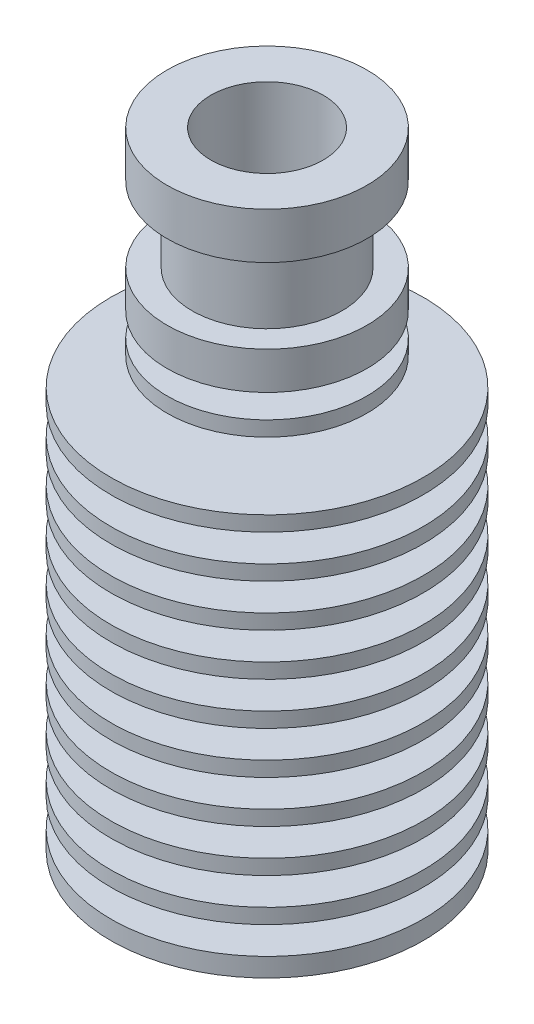
ISO-10303-21;
HEADER;
FILE_DESCRIPTION(('STEP AP214'),'2;1');
FILE_NAME('part.step','',(''),(''),'','','');
FILE_SCHEMA(('AUTOMOTIVE_DESIGN { 1 0 10303 214 1 1 1 1 }'));
ENDSEC;
DATA;
#1=APPLICATION_CONTEXT('core data for automotive mechanical design processes');
#2=APPLICATION_PROTOCOL_DEFINITION('international standard','automotive_design',2000,#1);
#3=PRODUCT_CONTEXT('',#1,'mechanical');
#4=PRODUCT('Part','Part','',(#3));
#5=PRODUCT_RELATED_PRODUCT_CATEGORY('part','',(#4));
#6=PRODUCT_DEFINITION_FORMATION('','',#4);
#7=PRODUCT_DEFINITION_CONTEXT('part definition',#1,'design');
#8=PRODUCT_DEFINITION('design','',#6,#7);
#9=PRODUCT_DEFINITION_SHAPE('','',#8);
#10=(LENGTH_UNIT() NAMED_UNIT(*) SI_UNIT(.MILLI.,.METRE.));
#11=(NAMED_UNIT(*) PLANE_ANGLE_UNIT() SI_UNIT($,.RADIAN.));
#12=(NAMED_UNIT(*) SI_UNIT($,.STERADIAN.) SOLID_ANGLE_UNIT());
#13=UNCERTAINTY_MEASURE_WITH_UNIT(LENGTH_MEASURE(1.E-05),#10,'distance_accuracy_value','');
#14=(GEOMETRIC_REPRESENTATION_CONTEXT(3) GLOBAL_UNCERTAINTY_ASSIGNED_CONTEXT((#13)) GLOBAL_UNIT_ASSIGNED_CONTEXT((#10,
#11,#12)) REPRESENTATION_CONTEXT('',''));
#15=CARTESIAN_POINT('',(0.,0.,0.));
#16=DIRECTION('',(0.,0.,1.));
#17=DIRECTION('',(1.,0.,0.));
#18=AXIS2_PLACEMENT_3D('',#15,#16,#17);
#19=CARTESIAN_POINT('',(0.,64.6374556213018,0.));
#20=DIRECTION('',(0.,1.,0.));
#21=DIRECTION('',(-1.,0.,0.));
#22=AXIS2_PLACEMENT_3D('',#19,#20,#21);
#23=CYLINDRICAL_SURFACE('',#22,8.);
#24=CARTESIAN_POINT('',(0.,54.9374556213018,0.));
#25=DIRECTION('',(0.,1.,0.));
#26=DIRECTION('',(-1.,0.,0.));
#27=AXIS2_PLACEMENT_3D('',#24,#25,#26);
#28=CIRCLE('',#27,8.);
#29=CARTESIAN_POINT('',(-8.,54.9374556213018,0.));
#30=VERTEX_POINT('',#29);
#31=EDGE_CURVE('E218',#30,#30,#28,.T.);
#32=ORIENTED_EDGE('',*,*,#31,.F.);
#33=EDGE_LOOP('',(#32));
#34=FACE_BOUND('',#33,.T.);
#35=CARTESIAN_POINT('',(0.,51.9374556213018,0.));
#36=DIRECTION('',(0.,1.,0.));
#37=DIRECTION('',(-1.,0.,0.));
#38=AXIS2_PLACEMENT_3D('',#35,#36,#37);
#39=CIRCLE('',#38,8.);
#40=CARTESIAN_POINT('',(-7.99999999999999,51.9374556213018,0.));
#41=VERTEX_POINT('',#40);
#42=EDGE_CURVE('E12',#41,#41,#39,.T.);
#43=ORIENTED_EDGE('',*,*,#42,.T.);
#44=EDGE_LOOP('',(#43));
#45=FACE_BOUND('',#44,.T.);
#46=ADVANCED_FACE('F40',(#34,#45),#23,.T.);
#47=CARTESIAN_POINT('',(8.,51.9374556213018,0.));
#48=DIRECTION('',(0.,1.,0.));
#49=DIRECTION('',(-1.,0.,0.));
#50=AXIS2_PLACEMENT_3D('',#47,#48,#49);
#51=PLANE('',#50);
#52=ORIENTED_EDGE('',*,*,#42,.F.);
#53=EDGE_LOOP('',(#52));
#54=FACE_BOUND('',#53,.T.);
#55=CARTESIAN_POINT('',(0.,51.9374556213018,0.));
#56=DIRECTION('',(0.,1.,0.));
#57=DIRECTION('',(-1.,0.,0.));
#58=AXIS2_PLACEMENT_3D('',#55,#56,#57);
#59=CIRCLE('',#58,4.5);
#60=CARTESIAN_POINT('',(-4.49999999999999,51.9374556213018,0.));
#61=VERTEX_POINT('',#60);
#62=EDGE_CURVE('E46',#61,#61,#59,.T.);
#63=ORIENTED_EDGE('',*,*,#62,.T.);
#64=EDGE_LOOP('',(#63));
#65=FACE_BOUND('',#64,.T.);
#66=ADVANCED_FACE('F225',(#54,#65),#51,.F.);
#67=CARTESIAN_POINT('',(0.,64.6374556213018,0.));
#68=DIRECTION('',(0.,1.,0.));
#69=DIRECTION('',(-1.,0.,0.));
#70=AXIS2_PLACEMENT_3D('',#67,#68,#69);
#71=CYLINDRICAL_SURFACE('',#70,4.5);
#72=ORIENTED_EDGE('',*,*,#62,.F.);
#73=EDGE_LOOP('',(#72));
#74=FACE_BOUND('',#73,.T.);
#75=CARTESIAN_POINT('',(0.,50.0374556213018,0.));
#76=DIRECTION('',(0.,1.,0.));
#77=DIRECTION('',(-1.,0.,0.));
#78=AXIS2_PLACEMENT_3D('',#75,#76,#77);
#79=CIRCLE('',#78,4.5);
#80=CARTESIAN_POINT('',(-4.49999999999999,50.0374556213018,0.));
#81=VERTEX_POINT('',#80);
#82=EDGE_CURVE('E50',#81,#81,#79,.T.);
#83=ORIENTED_EDGE('',*,*,#82,.T.);
#84=EDGE_LOOP('',(#83));
#85=FACE_BOUND('',#84,.T.);
#86=ADVANCED_FACE('F229',(#74,#85),#71,.T.);
#87=CARTESIAN_POINT('',(4.5,50.0374556213018,0.));
#88=DIRECTION('',(0.,-1.,0.));
#89=DIRECTION('',(1.,0.,0.));
#90=AXIS2_PLACEMENT_3D('',#87,#88,#89);
#91=PLANE('',#90);
#92=ORIENTED_EDGE('',*,*,#82,.F.);
#93=EDGE_LOOP('',(#92));
#94=FACE_BOUND('',#93,.T.);
#95=CARTESIAN_POINT('',(0.,50.0374556213018,0.));
#96=DIRECTION('',(0.,1.,0.));
#97=DIRECTION('',(-1.,0.,0.));
#98=AXIS2_PLACEMENT_3D('',#95,#96,#97);
#99=CIRCLE('',#98,8.);
#100=CARTESIAN_POINT('',(-7.99999999999999,50.0374556213018,0.));
#101=VERTEX_POINT('',#100);
#102=EDGE_CURVE('E54',#101,#101,#99,.T.);
#103=ORIENTED_EDGE('',*,*,#102,.T.);
#104=EDGE_LOOP('',(#103));
#105=FACE_BOUND('',#104,.T.);
#106=ADVANCED_FACE('F234',(#94,#105),#91,.F.);
#107=CARTESIAN_POINT('',(0.,64.6374556213018,0.));
#108=DIRECTION('',(0.,1.,0.));
#109=DIRECTION('',(-1.,0.,0.));
#110=AXIS2_PLACEMENT_3D('',#107,#108,#109);
#111=CYLINDRICAL_SURFACE('',#110,8.);
#112=ORIENTED_EDGE('',*,*,#102,.F.);
#113=EDGE_LOOP('',(#112));
#114=FACE_BOUND('',#113,.T.);
#115=CARTESIAN_POINT('',(0.,48.8374556213018,0.));
#116=DIRECTION('',(0.,1.,0.));
#117=DIRECTION('',(-1.,0.,0.));
#118=AXIS2_PLACEMENT_3D('',#115,#116,#117);
#119=CIRCLE('',#118,8.);
#120=CARTESIAN_POINT('',(-7.99999999999999,48.8374556213018,0.));
#121=VERTEX_POINT('',#120);
#122=EDGE_CURVE('E59',#121,#121,#119,.T.);
#123=ORIENTED_EDGE('',*,*,#122,.T.);
#124=EDGE_LOOP('',(#123));
#125=FACE_BOUND('',#124,.T.);
#126=ADVANCED_FACE('F240',(#114,#125),#111,.T.);
#127=CARTESIAN_POINT('',(8.,48.8374556213018,0.));
#128=DIRECTION('',(0.,1.,0.));
#129=DIRECTION('',(-1.,0.,0.));
#130=AXIS2_PLACEMENT_3D('',#127,#128,#129);
#131=PLANE('',#130);
#132=ORIENTED_EDGE('',*,*,#122,.F.);
#133=EDGE_LOOP('',(#132));
#134=FACE_BOUND('',#133,.T.);
#135=CARTESIAN_POINT('',(0.,48.8374556213018,0.));
#136=DIRECTION('',(0.,1.,0.));
#137=DIRECTION('',(-1.,0.,0.));
#138=AXIS2_PLACEMENT_3D('',#135,#136,#137);
#139=CIRCLE('',#138,4.);
#140=CARTESIAN_POINT('',(-4.,48.8374556213018,0.));
#141=VERTEX_POINT('',#140);
#142=EDGE_CURVE('E62',#141,#141,#139,.T.);
#143=ORIENTED_EDGE('',*,*,#142,.T.);
#144=EDGE_LOOP('',(#143));
#145=FACE_BOUND('',#144,.T.);
#146=ADVANCED_FACE('F244',(#134,#145),#131,.F.);
#147=CARTESIAN_POINT('',(0.,64.6374556213018,0.));
#148=DIRECTION('',(0.,1.,0.));
#149=DIRECTION('',(-1.,0.,0.));
#150=AXIS2_PLACEMENT_3D('',#147,#148,#149);
#151=CYLINDRICAL_SURFACE('',#150,4.);
#152=ORIENTED_EDGE('',*,*,#142,.F.);
#153=EDGE_LOOP('',(#152));
#154=FACE_BOUND('',#153,.T.);
#155=CARTESIAN_POINT('',(0.,46.6374556213018,0.));
#156=DIRECTION('',(0.,1.,0.));
#157=DIRECTION('',(-1.,0.,0.));
#158=AXIS2_PLACEMENT_3D('',#155,#156,#157);
#159=CIRCLE('',#158,4.);
#160=CARTESIAN_POINT('',(-3.99999999999999,46.6374556213018,0.));
#161=VERTEX_POINT('',#160);
#162=EDGE_CURVE('E65',#161,#161,#159,.T.);
#163=ORIENTED_EDGE('',*,*,#162,.T.);
#164=EDGE_LOOP('',(#163));
#165=FACE_BOUND('',#164,.T.);
#166=ADVANCED_FACE('F248',(#154,#165),#151,.T.);
#167=CARTESIAN_POINT('',(4.,46.6374556213018,0.));
#168=DIRECTION('',(0.,-1.,0.));
#169=DIRECTION('',(1.,0.,0.));
#170=AXIS2_PLACEMENT_3D('',#167,#168,#169);
#171=PLANE('',#170);
#172=ORIENTED_EDGE('',*,*,#162,.F.);
#173=EDGE_LOOP('',(#172));
#174=FACE_BOUND('',#173,.T.);
#175=CARTESIAN_POINT('',(0.,46.6374556213018,0.));
#176=DIRECTION('',(0.,1.,0.));
#177=DIRECTION('',(-1.,0.,0.));
#178=AXIS2_PLACEMENT_3D('',#175,#176,#177);
#179=CIRCLE('',#178,12.5);
#180=CARTESIAN_POINT('',(-12.5,46.6374556213018,0.));
#181=VERTEX_POINT('',#180);
#182=EDGE_CURVE('E68',#181,#181,#179,.T.);
#183=ORIENTED_EDGE('',*,*,#182,.T.);
#184=EDGE_LOOP('',(#183));
#185=FACE_BOUND('',#184,.T.);
#186=ADVANCED_FACE('F252',(#174,#185),#171,.F.);
#187=CARTESIAN_POINT('',(0.,64.6374556213018,0.));
#188=DIRECTION('',(0.,1.,0.));
#189=DIRECTION('',(-1.,0.,0.));
#190=AXIS2_PLACEMENT_3D('',#187,#188,#189);
#191=CYLINDRICAL_SURFACE('',#190,12.5);
#192=ORIENTED_EDGE('',*,*,#182,.F.);
#193=EDGE_LOOP('',(#192));
#194=FACE_BOUND('',#193,.T.);
#195=CARTESIAN_POINT('',(0.,45.4374556213018,0.));
#196=DIRECTION('',(0.,1.,0.));
#197=DIRECTION('',(-1.,0.,0.));
#198=AXIS2_PLACEMENT_3D('',#195,#196,#197);
#199=CIRCLE('',#198,12.5);
#200=CARTESIAN_POINT('',(-12.5,45.4374556213018,0.));
#201=VERTEX_POINT('',#200);
#202=EDGE_CURVE('E71',#201,#201,#199,.T.);
#203=ORIENTED_EDGE('',*,*,#202,.T.);
#204=EDGE_LOOP('',(#203));
#205=FACE_BOUND('',#204,.T.);
#206=ADVANCED_FACE('F256',(#194,#205),#191,.T.);
#207=CARTESIAN_POINT('',(12.5,45.4374556213018,0.));
#208=DIRECTION('',(0.,1.,0.));
#209=DIRECTION('',(-1.,0.,0.));
#210=AXIS2_PLACEMENT_3D('',#207,#208,#209);
#211=PLANE('',#210);
#212=ORIENTED_EDGE('',*,*,#202,.F.);
#213=EDGE_LOOP('',(#212));
#214=FACE_BOUND('',#213,.T.);
#215=CARTESIAN_POINT('',(0.,45.4374556213018,0.));
#216=DIRECTION('',(0.,1.,0.));
#217=DIRECTION('',(-1.,0.,0.));
#218=AXIS2_PLACEMENT_3D('',#215,#216,#217);
#219=CIRCLE('',#218,4.);
#220=CARTESIAN_POINT('',(-3.99999999999999,45.4374556213018,0.));
#221=VERTEX_POINT('',#220);
#222=EDGE_CURVE('E74',#221,#221,#219,.T.);
#223=ORIENTED_EDGE('',*,*,#222,.T.);
#224=EDGE_LOOP('',(#223));
#225=FACE_BOUND('',#224,.T.);
#226=ADVANCED_FACE('F260',(#214,#225),#211,.F.);
#227=CARTESIAN_POINT('',(0.,64.6374556213018,0.));
#228=DIRECTION('',(0.,1.,0.));
#229=DIRECTION('',(-1.,0.,0.));
#230=AXIS2_PLACEMENT_3D('',#227,#228,#229);
#231=CYLINDRICAL_SURFACE('',#230,4.);
#232=ORIENTED_EDGE('',*,*,#222,.F.);
#233=EDGE_LOOP('',(#232));
#234=FACE_BOUND('',#233,.T.);
#235=CARTESIAN_POINT('',(0.,43.2374556213018,0.));
#236=DIRECTION('',(0.,1.,0.));
#237=DIRECTION('',(-1.,0.,0.));
#238=AXIS2_PLACEMENT_3D('',#235,#236,#237);
#239=CIRCLE('',#238,4.);
#240=CARTESIAN_POINT('',(-3.99999999999999,43.2374556213018,0.));
#241=VERTEX_POINT('',#240);
#242=EDGE_CURVE('E77',#241,#241,#239,.T.);
#243=ORIENTED_EDGE('',*,*,#242,.T.);
#244=EDGE_LOOP('',(#243));
#245=FACE_BOUND('',#244,.T.);
#246=ADVANCED_FACE('F264',(#234,#245),#231,.T.);
#247=CARTESIAN_POINT('',(4.,43.2374556213018,0.));
#248=DIRECTION('',(0.,-1.,0.));
#249=DIRECTION('',(1.,0.,0.));
#250=AXIS2_PLACEMENT_3D('',#247,#248,#249);
#251=PLANE('',#250);
#252=ORIENTED_EDGE('',*,*,#242,.F.);
#253=EDGE_LOOP('',(#252));
#254=FACE_BOUND('',#253,.T.);
#255=CARTESIAN_POINT('',(0.,43.2374556213018,0.));
#256=DIRECTION('',(0.,1.,0.));
#257=DIRECTION('',(-1.,0.,0.));
#258=AXIS2_PLACEMENT_3D('',#255,#256,#257);
#259=CIRCLE('',#258,12.5);
#260=CARTESIAN_POINT('',(-12.5,43.2374556213018,0.));
#261=VERTEX_POINT('',#260);
#262=EDGE_CURVE('E80',#261,#261,#259,.T.);
#263=ORIENTED_EDGE('',*,*,#262,.T.);
#264=EDGE_LOOP('',(#263));
#265=FACE_BOUND('',#264,.T.);
#266=ADVANCED_FACE('F268',(#254,#265),#251,.F.);
#267=CARTESIAN_POINT('',(0.,64.6374556213018,0.));
#268=DIRECTION('',(0.,1.,0.));
#269=DIRECTION('',(-1.,0.,0.));
#270=AXIS2_PLACEMENT_3D('',#267,#268,#269);
#271=CYLINDRICAL_SURFACE('',#270,12.5);
#272=ORIENTED_EDGE('',*,*,#262,.F.);
#273=EDGE_LOOP('',(#272));
#274=FACE_BOUND('',#273,.T.);
#275=CARTESIAN_POINT('',(0.,42.0374556213018,0.));
#276=DIRECTION('',(0.,1.,0.));
#277=DIRECTION('',(-1.,0.,0.));
#278=AXIS2_PLACEMENT_3D('',#275,#276,#277);
#279=CIRCLE('',#278,12.5);
#280=CARTESIAN_POINT('',(-12.5,42.0374556213018,0.));
#281=VERTEX_POINT('',#280);
#282=EDGE_CURVE('E83',#281,#281,#279,.T.);
#283=ORIENTED_EDGE('',*,*,#282,.T.);
#284=EDGE_LOOP('',(#283));
#285=FACE_BOUND('',#284,.T.);
#286=ADVANCED_FACE('F272',(#274,#285),#271,.T.);
#287=CARTESIAN_POINT('',(12.5,42.0374556213018,0.));
#288=DIRECTION('',(0.,1.,0.));
#289=DIRECTION('',(-1.,0.,0.));
#290=AXIS2_PLACEMENT_3D('',#287,#288,#289);
#291=PLANE('',#290);
#292=ORIENTED_EDGE('',*,*,#282,.F.);
#293=EDGE_LOOP('',(#292));
#294=FACE_BOUND('',#293,.T.);
#295=CARTESIAN_POINT('',(0.,42.0374556213018,0.));
#296=DIRECTION('',(0.,1.,0.));
#297=DIRECTION('',(-1.,0.,0.));
#298=AXIS2_PLACEMENT_3D('',#295,#296,#297);
#299=CIRCLE('',#298,4.);
#300=CARTESIAN_POINT('',(-3.99999999999999,42.0374556213018,0.));
#301=VERTEX_POINT('',#300);
#302=EDGE_CURVE('E86',#301,#301,#299,.T.);
#303=ORIENTED_EDGE('',*,*,#302,.T.);
#304=EDGE_LOOP('',(#303));
#305=FACE_BOUND('',#304,.T.);
#306=ADVANCED_FACE('F276',(#294,#305),#291,.F.);
#307=CARTESIAN_POINT('',(0.,64.6374556213018,0.));
#308=DIRECTION('',(0.,1.,0.));
#309=DIRECTION('',(-1.,0.,0.));
#310=AXIS2_PLACEMENT_3D('',#307,#308,#309);
#311=CYLINDRICAL_SURFACE('',#310,4.);
#312=ORIENTED_EDGE('',*,*,#302,.F.);
#313=EDGE_LOOP('',(#312));
#314=FACE_BOUND('',#313,.T.);
#315=CARTESIAN_POINT('',(0.,39.8374556213018,0.));
#316=DIRECTION('',(0.,1.,0.));
#317=DIRECTION('',(-1.,0.,0.));
#318=AXIS2_PLACEMENT_3D('',#315,#316,#317);
#319=CIRCLE('',#318,4.);
#320=CARTESIAN_POINT('',(-3.99999999999999,39.8374556213018,0.));
#321=VERTEX_POINT('',#320);
#322=EDGE_CURVE('E89',#321,#321,#319,.T.);
#323=ORIENTED_EDGE('',*,*,#322,.T.);
#324=EDGE_LOOP('',(#323));
#325=FACE_BOUND('',#324,.T.);
#326=ADVANCED_FACE('F280',(#314,#325),#311,.T.);
#327=CARTESIAN_POINT('',(4.,39.8374556213018,0.));
#328=DIRECTION('',(0.,-1.,0.));
#329=DIRECTION('',(1.,0.,0.));
#330=AXIS2_PLACEMENT_3D('',#327,#328,#329);
#331=PLANE('',#330);
#332=ORIENTED_EDGE('',*,*,#322,.F.);
#333=EDGE_LOOP('',(#332));
#334=FACE_BOUND('',#333,.T.);
#335=CARTESIAN_POINT('',(0.,39.8374556213018,0.));
#336=DIRECTION('',(0.,1.,0.));
#337=DIRECTION('',(-1.,0.,0.));
#338=AXIS2_PLACEMENT_3D('',#335,#336,#337);
#339=CIRCLE('',#338,12.5);
#340=CARTESIAN_POINT('',(-12.5,39.8374556213018,0.));
#341=VERTEX_POINT('',#340);
#342=EDGE_CURVE('E92',#341,#341,#339,.T.);
#343=ORIENTED_EDGE('',*,*,#342,.T.);
#344=EDGE_LOOP('',(#343));
#345=FACE_BOUND('',#344,.T.);
#346=ADVANCED_FACE('F284',(#334,#345),#331,.F.);
#347=CARTESIAN_POINT('',(0.,64.6374556213018,0.));
#348=DIRECTION('',(0.,1.,0.));
#349=DIRECTION('',(-1.,0.,0.));
#350=AXIS2_PLACEMENT_3D('',#347,#348,#349);
#351=CYLINDRICAL_SURFACE('',#350,12.5);
#352=ORIENTED_EDGE('',*,*,#342,.F.);
#353=EDGE_LOOP('',(#352));
#354=FACE_BOUND('',#353,.T.);
#355=CARTESIAN_POINT('',(0.,38.6374556213018,0.));
#356=DIRECTION('',(0.,1.,0.));
#357=DIRECTION('',(-1.,0.,0.));
#358=AXIS2_PLACEMENT_3D('',#355,#356,#357);
#359=CIRCLE('',#358,12.5);
#360=CARTESIAN_POINT('',(-12.5,38.6374556213018,0.));
#361=VERTEX_POINT('',#360);
#362=EDGE_CURVE('E95',#361,#361,#359,.T.);
#363=ORIENTED_EDGE('',*,*,#362,.T.);
#364=EDGE_LOOP('',(#363));
#365=FACE_BOUND('',#364,.T.);
#366=ADVANCED_FACE('F288',(#354,#365),#351,.T.);
#367=CARTESIAN_POINT('',(12.5,38.6374556213018,0.));
#368=DIRECTION('',(0.,1.,0.));
#369=DIRECTION('',(-1.,0.,0.));
#370=AXIS2_PLACEMENT_3D('',#367,#368,#369);
#371=PLANE('',#370);
#372=ORIENTED_EDGE('',*,*,#362,.F.);
#373=EDGE_LOOP('',(#372));
#374=FACE_BOUND('',#373,.T.);
#375=CARTESIAN_POINT('',(0.,38.6374556213018,0.));
#376=DIRECTION('',(0.,1.,0.));
#377=DIRECTION('',(-1.,0.,0.));
#378=AXIS2_PLACEMENT_3D('',#375,#376,#377);
#379=CIRCLE('',#378,4.);
#380=CARTESIAN_POINT('',(-3.99999999999999,38.6374556213018,0.));
#381=VERTEX_POINT('',#380);
#382=EDGE_CURVE('E98',#381,#381,#379,.T.);
#383=ORIENTED_EDGE('',*,*,#382,.T.);
#384=EDGE_LOOP('',(#383));
#385=FACE_BOUND('',#384,.T.);
#386=ADVANCED_FACE('F292',(#374,#385),#371,.F.);
#387=CARTESIAN_POINT('',(0.,64.6374556213018,0.));
#388=DIRECTION('',(0.,1.,0.));
#389=DIRECTION('',(-1.,0.,0.));
#390=AXIS2_PLACEMENT_3D('',#387,#388,#389);
#391=CYLINDRICAL_SURFACE('',#390,4.);
#392=ORIENTED_EDGE('',*,*,#382,.F.);
#393=EDGE_LOOP('',(#392));
#394=FACE_BOUND('',#393,.T.);
#395=CARTESIAN_POINT('',(0.,36.4374556213018,0.));
#396=DIRECTION('',(0.,1.,0.));
#397=DIRECTION('',(-1.,0.,0.));
#398=AXIS2_PLACEMENT_3D('',#395,#396,#397);
#399=CIRCLE('',#398,4.);
#400=CARTESIAN_POINT('',(-3.99999999999999,36.4374556213018,0.));
#401=VERTEX_POINT('',#400);
#402=EDGE_CURVE('E101',#401,#401,#399,.T.);
#403=ORIENTED_EDGE('',*,*,#402,.T.);
#404=EDGE_LOOP('',(#403));
#405=FACE_BOUND('',#404,.T.);
#406=ADVANCED_FACE('F296',(#394,#405),#391,.T.);
#407=CARTESIAN_POINT('',(4.,36.4374556213018,0.));
#408=DIRECTION('',(0.,-1.,0.));
#409=DIRECTION('',(1.,0.,0.));
#410=AXIS2_PLACEMENT_3D('',#407,#408,#409);
#411=PLANE('',#410);
#412=ORIENTED_EDGE('',*,*,#402,.F.);
#413=EDGE_LOOP('',(#412));
#414=FACE_BOUND('',#413,.T.);
#415=CARTESIAN_POINT('',(0.,36.4374556213018,0.));
#416=DIRECTION('',(0.,1.,0.));
#417=DIRECTION('',(-1.,0.,0.));
#418=AXIS2_PLACEMENT_3D('',#415,#416,#417);
#419=CIRCLE('',#418,12.5);
#420=CARTESIAN_POINT('',(-12.5,36.4374556213018,0.));
#421=VERTEX_POINT('',#420);
#422=EDGE_CURVE('E104',#421,#421,#419,.T.);
#423=ORIENTED_EDGE('',*,*,#422,.T.);
#424=EDGE_LOOP('',(#423));
#425=FACE_BOUND('',#424,.T.);
#426=ADVANCED_FACE('F300',(#414,#425),#411,.F.);
#427=CARTESIAN_POINT('',(0.,64.6374556213018,0.));
#428=DIRECTION('',(0.,1.,0.));
#429=DIRECTION('',(-1.,0.,0.));
#430=AXIS2_PLACEMENT_3D('',#427,#428,#429);
#431=CYLINDRICAL_SURFACE('',#430,12.5);
#432=ORIENTED_EDGE('',*,*,#422,.F.);
#433=EDGE_LOOP('',(#432));
#434=FACE_BOUND('',#433,.T.);
#435=CARTESIAN_POINT('',(0.,35.2374556213018,0.));
#436=DIRECTION('',(0.,1.,0.));
#437=DIRECTION('',(-1.,0.,0.));
#438=AXIS2_PLACEMENT_3D('',#435,#436,#437);
#439=CIRCLE('',#438,12.5);
#440=CARTESIAN_POINT('',(-12.5,35.2374556213018,0.));
#441=VERTEX_POINT('',#440);
#442=EDGE_CURVE('E107',#441,#441,#439,.T.);
#443=ORIENTED_EDGE('',*,*,#442,.T.);
#444=EDGE_LOOP('',(#443));
#445=FACE_BOUND('',#444,.T.);
#446=ADVANCED_FACE('F304',(#434,#445),#431,.T.);
#447=CARTESIAN_POINT('',(12.5,35.2374556213018,0.));
#448=DIRECTION('',(0.,1.,0.));
#449=DIRECTION('',(-1.,0.,0.));
#450=AXIS2_PLACEMENT_3D('',#447,#448,#449);
#451=PLANE('',#450);
#452=ORIENTED_EDGE('',*,*,#442,.F.);
#453=EDGE_LOOP('',(#452));
#454=FACE_BOUND('',#453,.T.);
#455=CARTESIAN_POINT('',(0.,35.2374556213018,0.));
#456=DIRECTION('',(0.,1.,0.));
#457=DIRECTION('',(-1.,0.,0.));
#458=AXIS2_PLACEMENT_3D('',#455,#456,#457);
#459=CIRCLE('',#458,6.5);
#460=CARTESIAN_POINT('',(-6.49999999999999,35.2374556213018,0.));
#461=VERTEX_POINT('',#460);
#462=EDGE_CURVE('E110',#461,#461,#459,.T.);
#463=ORIENTED_EDGE('',*,*,#462,.T.);
#464=EDGE_LOOP('',(#463));
#465=FACE_BOUND('',#464,.T.);
#466=ADVANCED_FACE('F308',(#454,#465),#451,.F.);
#467=CARTESIAN_POINT('',(0.,64.6374556213018,0.));
#468=DIRECTION('',(0.,1.,0.));
#469=DIRECTION('',(-1.,0.,0.));
#470=AXIS2_PLACEMENT_3D('',#467,#468,#469);
#471=CYLINDRICAL_SURFACE('',#470,6.5);
#472=ORIENTED_EDGE('',*,*,#462,.F.);
#473=EDGE_LOOP('',(#472));
#474=FACE_BOUND('',#473,.T.);
#475=CARTESIAN_POINT('',(0.,33.0374556213018,0.));
#476=DIRECTION('',(0.,1.,0.));
#477=DIRECTION('',(-1.,0.,0.));
#478=AXIS2_PLACEMENT_3D('',#475,#476,#477);
#479=CIRCLE('',#478,6.5);
#480=CARTESIAN_POINT('',(-6.49999999999999,33.0374556213018,0.));
#481=VERTEX_POINT('',#480);
#482=EDGE_CURVE('E113',#481,#481,#479,.T.);
#483=ORIENTED_EDGE('',*,*,#482,.T.);
#484=EDGE_LOOP('',(#483));
#485=FACE_BOUND('',#484,.T.);
#486=ADVANCED_FACE('F312',(#474,#485),#471,.T.);
#487=CARTESIAN_POINT('',(6.5,33.0374556213018,0.));
#488=DIRECTION('',(0.,-1.,0.));
#489=DIRECTION('',(1.,0.,0.));
#490=AXIS2_PLACEMENT_3D('',#487,#488,#489);
#491=PLANE('',#490);
#492=ORIENTED_EDGE('',*,*,#482,.F.);
#493=EDGE_LOOP('',(#492));
#494=FACE_BOUND('',#493,.T.);
#495=CARTESIAN_POINT('',(0.,33.0374556213018,0.));
#496=DIRECTION('',(0.,1.,0.));
#497=DIRECTION('',(-1.,0.,0.));
#498=AXIS2_PLACEMENT_3D('',#495,#496,#497);
#499=CIRCLE('',#498,12.5);
#500=CARTESIAN_POINT('',(-12.5,33.0374556213018,0.));
#501=VERTEX_POINT('',#500);
#502=EDGE_CURVE('E116',#501,#501,#499,.T.);
#503=ORIENTED_EDGE('',*,*,#502,.T.);
#504=EDGE_LOOP('',(#503));
#505=FACE_BOUND('',#504,.T.);
#506=ADVANCED_FACE('F316',(#494,#505),#491,.F.);
#507=CARTESIAN_POINT('',(0.,64.6374556213018,0.));
#508=DIRECTION('',(0.,1.,0.));
#509=DIRECTION('',(-1.,0.,0.));
#510=AXIS2_PLACEMENT_3D('',#507,#508,#509);
#511=CYLINDRICAL_SURFACE('',#510,12.5);
#512=ORIENTED_EDGE('',*,*,#502,.F.);
#513=EDGE_LOOP('',(#512));
#514=FACE_BOUND('',#513,.T.);
#515=CARTESIAN_POINT('',(0.,31.8374556213018,0.));
#516=DIRECTION('',(0.,1.,0.));
#517=DIRECTION('',(-1.,0.,0.));
#518=AXIS2_PLACEMENT_3D('',#515,#516,#517);
#519=CIRCLE('',#518,12.5);
#520=CARTESIAN_POINT('',(-12.5,31.8374556213018,0.));
#521=VERTEX_POINT('',#520);
#522=EDGE_CURVE('E119',#521,#521,#519,.T.);
#523=ORIENTED_EDGE('',*,*,#522,.T.);
#524=EDGE_LOOP('',(#523));
#525=FACE_BOUND('',#524,.T.);
#526=ADVANCED_FACE('F320',(#514,#525),#511,.T.);
#527=CARTESIAN_POINT('',(12.5,31.8374556213018,0.));
#528=DIRECTION('',(0.,1.,0.));
#529=DIRECTION('',(-1.,0.,0.));
#530=AXIS2_PLACEMENT_3D('',#527,#528,#529);
#531=PLANE('',#530);
#532=ORIENTED_EDGE('',*,*,#522,.F.);
#533=EDGE_LOOP('',(#532));
#534=FACE_BOUND('',#533,.T.);
#535=CARTESIAN_POINT('',(0.,31.8374556213018,0.));
#536=DIRECTION('',(0.,1.,0.));
#537=DIRECTION('',(-1.,0.,0.));
#538=AXIS2_PLACEMENT_3D('',#535,#536,#537);
#539=CIRCLE('',#538,7.5);
#540=CARTESIAN_POINT('',(-7.49999999999999,31.8374556213018,0.));
#541=VERTEX_POINT('',#540);
#542=EDGE_CURVE('E122',#541,#541,#539,.T.);
#543=ORIENTED_EDGE('',*,*,#542,.T.);
#544=EDGE_LOOP('',(#543));
#545=FACE_BOUND('',#544,.T.);
#546=ADVANCED_FACE('F324',(#534,#545),#531,.F.);
#547=CARTESIAN_POINT('',(0.,64.6374556213018,0.));
#548=DIRECTION('',(0.,1.,0.));
#549=DIRECTION('',(-1.,0.,0.));
#550=AXIS2_PLACEMENT_3D('',#547,#548,#549);
#551=CYLINDRICAL_SURFACE('',#550,7.5);
#552=ORIENTED_EDGE('',*,*,#542,.F.);
#553=EDGE_LOOP('',(#552));
#554=FACE_BOUND('',#553,.T.);
#555=CARTESIAN_POINT('',(0.,29.6374556213018,0.));
#556=DIRECTION('',(0.,1.,0.));
#557=DIRECTION('',(-1.,0.,0.));
#558=AXIS2_PLACEMENT_3D('',#555,#556,#557);
#559=CIRCLE('',#558,7.5);
#560=CARTESIAN_POINT('',(-7.49999999999999,29.6374556213018,0.));
#561=VERTEX_POINT('',#560);
#562=EDGE_CURVE('E125',#561,#561,#559,.T.);
#563=ORIENTED_EDGE('',*,*,#562,.T.);
#564=EDGE_LOOP('',(#563));
#565=FACE_BOUND('',#564,.T.);
#566=ADVANCED_FACE('F328',(#554,#565),#551,.T.);
#567=CARTESIAN_POINT('',(7.5,29.6374556213018,0.));
#568=DIRECTION('',(0.,-1.,0.));
#569=DIRECTION('',(1.,0.,0.));
#570=AXIS2_PLACEMENT_3D('',#567,#568,#569);
#571=PLANE('',#570);
#572=ORIENTED_EDGE('',*,*,#562,.F.);
#573=EDGE_LOOP('',(#572));
#574=FACE_BOUND('',#573,.T.);
#575=CARTESIAN_POINT('',(0.,29.6374556213018,0.));
#576=DIRECTION('',(0.,1.,0.));
#577=DIRECTION('',(-1.,0.,0.));
#578=AXIS2_PLACEMENT_3D('',#575,#576,#577);
#579=CIRCLE('',#578,12.5);
#580=CARTESIAN_POINT('',(-12.5,29.6374556213018,0.));
#581=VERTEX_POINT('',#580);
#582=EDGE_CURVE('E128',#581,#581,#579,.T.);
#583=ORIENTED_EDGE('',*,*,#582,.T.);
#584=EDGE_LOOP('',(#583));
#585=FACE_BOUND('',#584,.T.);
#586=ADVANCED_FACE('F332',(#574,#585),#571,.F.);
#587=CARTESIAN_POINT('',(0.,64.6374556213018,0.));
#588=DIRECTION('',(0.,1.,0.));
#589=DIRECTION('',(-1.,0.,0.));
#590=AXIS2_PLACEMENT_3D('',#587,#588,#589);
#591=CYLINDRICAL_SURFACE('',#590,12.5);
#592=ORIENTED_EDGE('',*,*,#582,.F.);
#593=EDGE_LOOP('',(#592));
#594=FACE_BOUND('',#593,.T.);
#595=CARTESIAN_POINT('',(0.,28.4374556213018,0.));
#596=DIRECTION('',(0.,1.,0.));
#597=DIRECTION('',(-1.,0.,0.));
#598=AXIS2_PLACEMENT_3D('',#595,#596,#597);
#599=CIRCLE('',#598,12.5);
#600=CARTESIAN_POINT('',(-12.5,28.4374556213018,0.));
#601=VERTEX_POINT('',#600);
#602=EDGE_CURVE('E131',#601,#601,#599,.T.);
#603=ORIENTED_EDGE('',*,*,#602,.T.);
#604=EDGE_LOOP('',(#603));
#605=FACE_BOUND('',#604,.T.);
#606=ADVANCED_FACE('F336',(#594,#605),#591,.T.);
#607=CARTESIAN_POINT('',(12.5,28.4374556213018,0.));
#608=DIRECTION('',(0.,1.,0.));
#609=DIRECTION('',(-1.,0.,0.));
#610=AXIS2_PLACEMENT_3D('',#607,#608,#609);
#611=PLANE('',#610);
#612=ORIENTED_EDGE('',*,*,#602,.F.);
#613=EDGE_LOOP('',(#612));
#614=FACE_BOUND('',#613,.T.);
#615=CARTESIAN_POINT('',(0.,28.4374556213018,0.));
#616=DIRECTION('',(0.,1.,0.));
#617=DIRECTION('',(-1.,0.,0.));
#618=AXIS2_PLACEMENT_3D('',#615,#616,#617);
#619=CIRCLE('',#618,7.5);
#620=CARTESIAN_POINT('',(-7.49999999999999,28.4374556213018,0.));
#621=VERTEX_POINT('',#620);
#622=EDGE_CURVE('E134',#621,#621,#619,.T.);
#623=ORIENTED_EDGE('',*,*,#622,.T.);
#624=EDGE_LOOP('',(#623));
#625=FACE_BOUND('',#624,.T.);
#626=ADVANCED_FACE('F340',(#614,#625),#611,.F.);
#627=CARTESIAN_POINT('',(0.,64.6374556213018,0.));
#628=DIRECTION('',(0.,1.,0.));
#629=DIRECTION('',(-1.,0.,0.));
#630=AXIS2_PLACEMENT_3D('',#627,#628,#629);
#631=CYLINDRICAL_SURFACE('',#630,7.5);
#632=ORIENTED_EDGE('',*,*,#622,.F.);
#633=EDGE_LOOP('',(#632));
#634=FACE_BOUND('',#633,.T.);
#635=CARTESIAN_POINT('',(0.,26.2374556213018,0.));
#636=DIRECTION('',(0.,1.,0.));
#637=DIRECTION('',(-1.,0.,0.));
#638=AXIS2_PLACEMENT_3D('',#635,#636,#637);
#639=CIRCLE('',#638,7.5);
#640=CARTESIAN_POINT('',(-7.49999999999999,26.2374556213018,0.));
#641=VERTEX_POINT('',#640);
#642=EDGE_CURVE('E137',#641,#641,#639,.T.);
#643=ORIENTED_EDGE('',*,*,#642,.T.);
#644=EDGE_LOOP('',(#643));
#645=FACE_BOUND('',#644,.T.);
#646=ADVANCED_FACE('F344',(#634,#645),#631,.T.);
#647=CARTESIAN_POINT('',(7.5,26.2374556213018,0.));
#648=DIRECTION('',(0.,-1.,0.));
#649=DIRECTION('',(1.,0.,0.));
#650=AXIS2_PLACEMENT_3D('',#647,#648,#649);
#651=PLANE('',#650);
#652=ORIENTED_EDGE('',*,*,#642,.F.);
#653=EDGE_LOOP('',(#652));
#654=FACE_BOUND('',#653,.T.);
#655=CARTESIAN_POINT('',(0.,26.2374556213018,0.));
#656=DIRECTION('',(0.,1.,0.));
#657=DIRECTION('',(-1.,0.,0.));
#658=AXIS2_PLACEMENT_3D('',#655,#656,#657);
#659=CIRCLE('',#658,12.5);
#660=CARTESIAN_POINT('',(-12.5,26.2374556213018,0.));
#661=VERTEX_POINT('',#660);
#662=EDGE_CURVE('E140',#661,#661,#659,.T.);
#663=ORIENTED_EDGE('',*,*,#662,.T.);
#664=EDGE_LOOP('',(#663));
#665=FACE_BOUND('',#664,.T.);
#666=ADVANCED_FACE('F348',(#654,#665),#651,.F.);
#667=CARTESIAN_POINT('',(0.,64.6374556213018,0.));
#668=DIRECTION('',(0.,1.,0.));
#669=DIRECTION('',(-1.,0.,0.));
#670=AXIS2_PLACEMENT_3D('',#667,#668,#669);
#671=CYLINDRICAL_SURFACE('',#670,12.5);
#672=ORIENTED_EDGE('',*,*,#662,.F.);
#673=EDGE_LOOP('',(#672));
#674=FACE_BOUND('',#673,.T.);
#675=CARTESIAN_POINT('',(0.,25.0374556213018,0.));
#676=DIRECTION('',(0.,1.,0.));
#677=DIRECTION('',(-1.,0.,0.));
#678=AXIS2_PLACEMENT_3D('',#675,#676,#677);
#679=CIRCLE('',#678,12.5);
#680=CARTESIAN_POINT('',(-12.5,25.0374556213018,0.));
#681=VERTEX_POINT('',#680);
#682=EDGE_CURVE('E143',#681,#681,#679,.T.);
#683=ORIENTED_EDGE('',*,*,#682,.T.);
#684=EDGE_LOOP('',(#683));
#685=FACE_BOUND('',#684,.T.);
#686=ADVANCED_FACE('F352',(#674,#685),#671,.T.);
#687=CARTESIAN_POINT('',(12.5,25.0374556213018,0.));
#688=DIRECTION('',(0.,1.,0.));
#689=DIRECTION('',(-1.,0.,0.));
#690=AXIS2_PLACEMENT_3D('',#687,#688,#689);
#691=PLANE('',#690);
#692=ORIENTED_EDGE('',*,*,#682,.F.);
#693=EDGE_LOOP('',(#692));
#694=FACE_BOUND('',#693,.T.);
#695=CARTESIAN_POINT('',(0.,25.0374556213018,0.));
#696=DIRECTION('',(0.,1.,0.));
#697=DIRECTION('',(-1.,0.,0.));
#698=AXIS2_PLACEMENT_3D('',#695,#696,#697);
#699=CIRCLE('',#698,7.5);
#700=CARTESIAN_POINT('',(-7.49999999999999,25.0374556213018,0.));
#701=VERTEX_POINT('',#700);
#702=EDGE_CURVE('E146',#701,#701,#699,.T.);
#703=ORIENTED_EDGE('',*,*,#702,.T.);
#704=EDGE_LOOP('',(#703));
#705=FACE_BOUND('',#704,.T.);
#706=ADVANCED_FACE('F356',(#694,#705),#691,.F.);
#707=CARTESIAN_POINT('',(0.,64.6374556213018,0.));
#708=DIRECTION('',(0.,1.,0.));
#709=DIRECTION('',(-1.,0.,0.));
#710=AXIS2_PLACEMENT_3D('',#707,#708,#709);
#711=CYLINDRICAL_SURFACE('',#710,7.5);
#712=ORIENTED_EDGE('',*,*,#702,.F.);
#713=EDGE_LOOP('',(#712));
#714=FACE_BOUND('',#713,.T.);
#715=CARTESIAN_POINT('',(0.,22.8374556213018,0.));
#716=DIRECTION('',(0.,1.,0.));
#717=DIRECTION('',(-1.,0.,0.));
#718=AXIS2_PLACEMENT_3D('',#715,#716,#717);
#719=CIRCLE('',#718,7.5);
#720=CARTESIAN_POINT('',(-7.49999999999999,22.8374556213018,0.));
#721=VERTEX_POINT('',#720);
#722=EDGE_CURVE('E149',#721,#721,#719,.T.);
#723=ORIENTED_EDGE('',*,*,#722,.T.);
#724=EDGE_LOOP('',(#723));
#725=FACE_BOUND('',#724,.T.);
#726=ADVANCED_FACE('F360',(#714,#725),#711,.T.);
#727=CARTESIAN_POINT('',(7.5,22.8374556213018,0.));
#728=DIRECTION('',(0.,-1.,0.));
#729=DIRECTION('',(1.,0.,0.));
#730=AXIS2_PLACEMENT_3D('',#727,#728,#729);
#731=PLANE('',#730);
#732=ORIENTED_EDGE('',*,*,#722,.F.);
#733=EDGE_LOOP('',(#732));
#734=FACE_BOUND('',#733,.T.);
#735=CARTESIAN_POINT('',(0.,22.8374556213018,0.));
#736=DIRECTION('',(0.,1.,0.));
#737=DIRECTION('',(-1.,0.,0.));
#738=AXIS2_PLACEMENT_3D('',#735,#736,#737);
#739=CIRCLE('',#738,12.5);
#740=CARTESIAN_POINT('',(-12.5,22.8374556213018,0.));
#741=VERTEX_POINT('',#740);
#742=EDGE_CURVE('E152',#741,#741,#739,.T.);
#743=ORIENTED_EDGE('',*,*,#742,.T.);
#744=EDGE_LOOP('',(#743));
#745=FACE_BOUND('',#744,.T.);
#746=ADVANCED_FACE('F364',(#734,#745),#731,.F.);
#747=CARTESIAN_POINT('',(0.,64.6374556213018,0.));
#748=DIRECTION('',(0.,1.,0.));
#749=DIRECTION('',(-1.,0.,0.));
#750=AXIS2_PLACEMENT_3D('',#747,#748,#749);
#751=CYLINDRICAL_SURFACE('',#750,12.5);
#752=ORIENTED_EDGE('',*,*,#742,.F.);
#753=EDGE_LOOP('',(#752));
#754=FACE_BOUND('',#753,.T.);
#755=CARTESIAN_POINT('',(0.,21.6374556213018,0.));
#756=DIRECTION('',(0.,1.,0.));
#757=DIRECTION('',(-1.,0.,0.));
#758=AXIS2_PLACEMENT_3D('',#755,#756,#757);
#759=CIRCLE('',#758,12.5);
#760=CARTESIAN_POINT('',(-12.5,21.6374556213018,0.));
#761=VERTEX_POINT('',#760);
#762=EDGE_CURVE('E155',#761,#761,#759,.T.);
#763=ORIENTED_EDGE('',*,*,#762,.T.);
#764=EDGE_LOOP('',(#763));
#765=FACE_BOUND('',#764,.T.);
#766=ADVANCED_FACE('F368',(#754,#765),#751,.T.);
#767=CARTESIAN_POINT('',(12.5,21.6374556213018,0.));
#768=DIRECTION('',(0.,1.,0.));
#769=DIRECTION('',(-1.,0.,0.));
#770=AXIS2_PLACEMENT_3D('',#767,#768,#769);
#771=PLANE('',#770);
#772=ORIENTED_EDGE('',*,*,#762,.F.);
#773=EDGE_LOOP('',(#772));
#774=FACE_BOUND('',#773,.T.);
#775=CARTESIAN_POINT('',(0.,21.6374556213018,0.));
#776=DIRECTION('',(0.,1.,0.));
#777=DIRECTION('',(-1.,0.,0.));
#778=AXIS2_PLACEMENT_3D('',#775,#776,#777);
#779=CIRCLE('',#778,7.5);
#780=CARTESIAN_POINT('',(-7.49999999999999,21.6374556213018,0.));
#781=VERTEX_POINT('',#780);
#782=EDGE_CURVE('E158',#781,#781,#779,.T.);
#783=ORIENTED_EDGE('',*,*,#782,.T.);
#784=EDGE_LOOP('',(#783));
#785=FACE_BOUND('',#784,.T.);
#786=ADVANCED_FACE('F372',(#774,#785),#771,.F.);
#787=CARTESIAN_POINT('',(0.,64.6374556213018,0.));
#788=DIRECTION('',(0.,1.,0.));
#789=DIRECTION('',(-1.,0.,0.));
#790=AXIS2_PLACEMENT_3D('',#787,#788,#789);
#791=CYLINDRICAL_SURFACE('',#790,7.5);
#792=ORIENTED_EDGE('',*,*,#782,.F.);
#793=EDGE_LOOP('',(#792));
#794=FACE_BOUND('',#793,.T.);
#795=CARTESIAN_POINT('',(0.,19.4374556213018,0.));
#796=DIRECTION('',(0.,1.,0.));
#797=DIRECTION('',(-1.,0.,0.));
#798=AXIS2_PLACEMENT_3D('',#795,#796,#797);
#799=CIRCLE('',#798,7.5);
#800=CARTESIAN_POINT('',(-7.49999999999999,19.4374556213018,0.));
#801=VERTEX_POINT('',#800);
#802=EDGE_CURVE('E161',#801,#801,#799,.T.);
#803=ORIENTED_EDGE('',*,*,#802,.T.);
#804=EDGE_LOOP('',(#803));
#805=FACE_BOUND('',#804,.T.);
#806=ADVANCED_FACE('F376',(#794,#805),#791,.T.);
#807=CARTESIAN_POINT('',(7.5,19.4374556213018,0.));
#808=DIRECTION('',(0.,-1.,0.));
#809=DIRECTION('',(1.,0.,0.));
#810=AXIS2_PLACEMENT_3D('',#807,#808,#809);
#811=PLANE('',#810);
#812=ORIENTED_EDGE('',*,*,#802,.F.);
#813=EDGE_LOOP('',(#812));
#814=FACE_BOUND('',#813,.T.);
#815=CARTESIAN_POINT('',(0.,19.4374556213018,0.));
#816=DIRECTION('',(0.,1.,0.));
#817=DIRECTION('',(-1.,0.,0.));
#818=AXIS2_PLACEMENT_3D('',#815,#816,#817);
#819=CIRCLE('',#818,12.5);
#820=CARTESIAN_POINT('',(-12.5,19.4374556213018,0.));
#821=VERTEX_POINT('',#820);
#822=EDGE_CURVE('E164',#821,#821,#819,.T.);
#823=ORIENTED_EDGE('',*,*,#822,.T.);
#824=EDGE_LOOP('',(#823));
#825=FACE_BOUND('',#824,.T.);
#826=ADVANCED_FACE('F380',(#814,#825),#811,.F.);
#827=CARTESIAN_POINT('',(0.,64.6374556213018,0.));
#828=DIRECTION('',(0.,1.,0.));
#829=DIRECTION('',(-1.,0.,0.));
#830=AXIS2_PLACEMENT_3D('',#827,#828,#829);
#831=CYLINDRICAL_SURFACE('',#830,12.5);
#832=ORIENTED_EDGE('',*,*,#822,.F.);
#833=EDGE_LOOP('',(#832));
#834=FACE_BOUND('',#833,.T.);
#835=CARTESIAN_POINT('',(0.,18.2374556213018,0.));
#836=DIRECTION('',(0.,1.,0.));
#837=DIRECTION('',(-1.,0.,0.));
#838=AXIS2_PLACEMENT_3D('',#835,#836,#837);
#839=CIRCLE('',#838,12.5);
#840=CARTESIAN_POINT('',(-12.5,18.2374556213018,0.));
#841=VERTEX_POINT('',#840);
#842=EDGE_CURVE('E167',#841,#841,#839,.T.);
#843=ORIENTED_EDGE('',*,*,#842,.T.);
#844=EDGE_LOOP('',(#843));
#845=FACE_BOUND('',#844,.T.);
#846=ADVANCED_FACE('F384',(#834,#845),#831,.T.);
#847=CARTESIAN_POINT('',(12.5,18.2374556213018,0.));
#848=DIRECTION('',(0.,1.,0.));
#849=DIRECTION('',(-1.,0.,0.));
#850=AXIS2_PLACEMENT_3D('',#847,#848,#849);
#851=PLANE('',#850);
#852=ORIENTED_EDGE('',*,*,#842,.F.);
#853=EDGE_LOOP('',(#852));
#854=FACE_BOUND('',#853,.T.);
#855=CARTESIAN_POINT('',(0.,18.2374556213018,0.));
#856=DIRECTION('',(0.,1.,0.));
#857=DIRECTION('',(-1.,0.,0.));
#858=AXIS2_PLACEMENT_3D('',#855,#856,#857);
#859=CIRCLE('',#858,7.5);
#860=CARTESIAN_POINT('',(-7.49999999999999,18.2374556213018,0.));
#861=VERTEX_POINT('',#860);
#862=EDGE_CURVE('E170',#861,#861,#859,.T.);
#863=ORIENTED_EDGE('',*,*,#862,.T.);
#864=EDGE_LOOP('',(#863));
#865=FACE_BOUND('',#864,.T.);
#866=ADVANCED_FACE('F388',(#854,#865),#851,.F.);
#867=CARTESIAN_POINT('',(0.,64.6374556213018,0.));
#868=DIRECTION('',(0.,1.,0.));
#869=DIRECTION('',(-1.,0.,0.));
#870=AXIS2_PLACEMENT_3D('',#867,#868,#869);
#871=CYLINDRICAL_SURFACE('',#870,7.5);
#872=ORIENTED_EDGE('',*,*,#862,.F.);
#873=EDGE_LOOP('',(#872));
#874=FACE_BOUND('',#873,.T.);
#875=CARTESIAN_POINT('',(0.,16.0374556213018,0.));
#876=DIRECTION('',(0.,1.,0.));
#877=DIRECTION('',(-1.,0.,0.));
#878=AXIS2_PLACEMENT_3D('',#875,#876,#877);
#879=CIRCLE('',#878,7.5);
#880=CARTESIAN_POINT('',(-7.49999999999999,16.0374556213018,0.));
#881=VERTEX_POINT('',#880);
#882=EDGE_CURVE('E173',#881,#881,#879,.T.);
#883=ORIENTED_EDGE('',*,*,#882,.T.);
#884=EDGE_LOOP('',(#883));
#885=FACE_BOUND('',#884,.T.);
#886=ADVANCED_FACE('F392',(#874,#885),#871,.T.);
#887=CARTESIAN_POINT('',(7.5,16.0374556213018,0.));
#888=DIRECTION('',(0.,-1.,0.));
#889=DIRECTION('',(1.,0.,0.));
#890=AXIS2_PLACEMENT_3D('',#887,#888,#889);
#891=PLANE('',#890);
#892=ORIENTED_EDGE('',*,*,#882,.F.);
#893=EDGE_LOOP('',(#892));
#894=FACE_BOUND('',#893,.T.);
#895=CARTESIAN_POINT('',(0.,16.0374556213018,0.));
#896=DIRECTION('',(0.,1.,0.));
#897=DIRECTION('',(-1.,0.,0.));
#898=AXIS2_PLACEMENT_3D('',#895,#896,#897);
#899=CIRCLE('',#898,12.5);
#900=CARTESIAN_POINT('',(-12.5,16.0374556213018,0.));
#901=VERTEX_POINT('',#900);
#902=EDGE_CURVE('E176',#901,#901,#899,.T.);
#903=ORIENTED_EDGE('',*,*,#902,.T.);
#904=EDGE_LOOP('',(#903));
#905=FACE_BOUND('',#904,.T.);
#906=ADVANCED_FACE('F396',(#894,#905),#891,.F.);
#907=CARTESIAN_POINT('',(0.,64.6374556213018,0.));
#908=DIRECTION('',(0.,1.,0.));
#909=DIRECTION('',(-1.,0.,0.));
#910=AXIS2_PLACEMENT_3D('',#907,#908,#909);
#911=CYLINDRICAL_SURFACE('',#910,12.5);
#912=ORIENTED_EDGE('',*,*,#902,.F.);
#913=EDGE_LOOP('',(#912));
#914=FACE_BOUND('',#913,.T.);
#915=CARTESIAN_POINT('',(0.,14.5374556213018,0.));
#916=DIRECTION('',(0.,1.,0.));
#917=DIRECTION('',(-1.,0.,0.));
#918=AXIS2_PLACEMENT_3D('',#915,#916,#917);
#919=CIRCLE('',#918,12.5);
#920=CARTESIAN_POINT('',(-12.5,14.5374556213018,0.));
#921=VERTEX_POINT('',#920);
#922=EDGE_CURVE('E179',#921,#921,#919,.T.);
#923=ORIENTED_EDGE('',*,*,#922,.T.);
#924=EDGE_LOOP('',(#923));
#925=FACE_BOUND('',#924,.T.);
#926=ADVANCED_FACE('F400',(#914,#925),#911,.T.);
#927=CARTESIAN_POINT('',(3.00000000000001,14.5374556213018,0.));
#928=DIRECTION('',(0.,1.,0.));
#929=DIRECTION('',(-1.,0.,0.));
#930=AXIS2_PLACEMENT_3D('',#927,#928,#929);
#931=PLANE('',#930);
#932=ORIENTED_EDGE('',*,*,#922,.F.);
#933=EDGE_LOOP('',(#932));
#934=FACE_BOUND('',#933,.T.);
#935=CARTESIAN_POINT('',(0.,14.5374556213018,0.));
#936=DIRECTION('',(0.,1.,0.));
#937=DIRECTION('',(-1.,0.,0.));
#938=AXIS2_PLACEMENT_3D('',#935,#936,#937);
#939=CIRCLE('',#938,3.);
#940=CARTESIAN_POINT('',(-2.99999999999999,14.5374556213018,0.));
#941=VERTEX_POINT('',#940);
#942=EDGE_CURVE('E182',#941,#941,#939,.T.);
#943=ORIENTED_EDGE('',*,*,#942,.T.);
#944=EDGE_LOOP('',(#943));
#945=FACE_BOUND('',#944,.T.);
#946=ADVANCED_FACE('F404',(#934,#945),#931,.F.);
#947=CARTESIAN_POINT('',(0.,64.6374556213018,0.));
#948=DIRECTION('',(0.,1.,0.));
#949=DIRECTION('',(-1.,0.,0.));
#950=AXIS2_PLACEMENT_3D('',#947,#948,#949);
#951=CYLINDRICAL_SURFACE('',#950,3.);
#952=ORIENTED_EDGE('',*,*,#942,.F.);
#953=EDGE_LOOP('',(#952));
#954=FACE_BOUND('',#953,.T.);
#955=CARTESIAN_POINT('',(0.,31.8374556213018,0.));
#956=DIRECTION('',(0.,1.,0.));
#957=DIRECTION('',(-1.,0.,0.));
#958=AXIS2_PLACEMENT_3D('',#955,#956,#957);
#959=CIRCLE('',#958,3.);
#960=CARTESIAN_POINT('',(-3.,31.8374556213018,0.));
#961=VERTEX_POINT('',#960);
#962=EDGE_CURVE('E185',#961,#961,#959,.T.);
#963=ORIENTED_EDGE('',*,*,#962,.T.);
#964=EDGE_LOOP('',(#963));
#965=FACE_BOUND('',#964,.T.);
#966=ADVANCED_FACE('F408',(#954,#965),#951,.F.);
#967=CARTESIAN_POINT('',(1.,31.8374556213018,0.));
#968=DIRECTION('',(0.,1.,0.));
#969=DIRECTION('',(-1.,0.,0.));
#970=AXIS2_PLACEMENT_3D('',#967,#968,#969);
#971=PLANE('',#970);
#972=ORIENTED_EDGE('',*,*,#962,.F.);
#973=EDGE_LOOP('',(#972));
#974=FACE_BOUND('',#973,.T.);
#975=CARTESIAN_POINT('',(0.,31.8374556213018,0.));
#976=DIRECTION('',(0.,1.,0.));
#977=DIRECTION('',(-1.,0.,0.));
#978=AXIS2_PLACEMENT_3D('',#975,#976,#977);
#979=CIRCLE('',#978,0.999999999999999);
#980=CARTESIAN_POINT('',(-0.999999999999994,31.8374556213018,0.));
#981=VERTEX_POINT('',#980);
#982=EDGE_CURVE('E188',#981,#981,#979,.T.);
#983=ORIENTED_EDGE('',*,*,#982,.T.);
#984=EDGE_LOOP('',(#983));
#985=FACE_BOUND('',#984,.T.);
#986=ADVANCED_FACE('F412',(#974,#985),#971,.F.);
#987=CARTESIAN_POINT('',(0.,64.6374556213018,0.));
#988=DIRECTION('',(0.,1.,0.));
#989=DIRECTION('',(-1.,0.,0.));
#990=AXIS2_PLACEMENT_3D('',#987,#988,#989);
#991=CYLINDRICAL_SURFACE('',#990,1.);
#992=ORIENTED_EDGE('',*,*,#982,.F.);
#993=EDGE_LOOP('',(#992));
#994=FACE_BOUND('',#993,.T.);
#995=CARTESIAN_POINT('',(0.,46.6374556213018,0.));
#996=DIRECTION('',(0.,1.,0.));
#997=DIRECTION('',(-1.,0.,0.));
#998=AXIS2_PLACEMENT_3D('',#995,#996,#997);
#999=CIRCLE('',#998,1.);
#1000=CARTESIAN_POINT('',(-0.999999999999997,46.6374556213018,0.));
#1001=VERTEX_POINT('',#1000);
#1002=EDGE_CURVE('E191',#1001,#1001,#999,.T.);
#1003=ORIENTED_EDGE('',*,*,#1002,.T.);
#1004=EDGE_LOOP('',(#1003));
#1005=FACE_BOUND('',#1004,.T.);
#1006=ADVANCED_FACE('F416',(#994,#1005),#991,.F.);
#1007=CARTESIAN_POINT('',(0.,46.9361793209827,0.));
#1008=DIRECTION('',(0.,1.,0.));
#1009=DIRECTION('',(-1.,0.,0.));
#1010=AXIS2_PLACEMENT_3D('',#1007,#1008,#1009);
#1011=CONICAL_SURFACE('',#1010,2.,1.28051086096433);
#1012=ORIENTED_EDGE('',*,*,#1002,.F.);
#1013=EDGE_LOOP('',(#1012));
#1014=FACE_BOUND('',#1013,.T.);
#1015=CARTESIAN_POINT('',(0.,46.9361793209827,0.));
#1016=DIRECTION('',(0.,1.,0.));
#1017=DIRECTION('',(-1.,0.,0.));
#1018=AXIS2_PLACEMENT_3D('',#1015,#1016,#1017);
#1019=CIRCLE('',#1018,2.);
#1020=CARTESIAN_POINT('',(-2.,46.9361793209827,0.));
#1021=VERTEX_POINT('',#1020);
#1022=EDGE_CURVE('E194',#1021,#1021,#1019,.T.);
#1023=ORIENTED_EDGE('',*,*,#1022,.T.);
#1024=EDGE_LOOP('',(#1023));
#1025=FACE_BOUND('',#1024,.T.);
#1026=ADVANCED_FACE('F420',(#1014,#1025),#1011,.F.);
#1027=CARTESIAN_POINT('',(0.,64.6374556213018,0.));
#1028=DIRECTION('',(0.,1.,0.));
#1029=DIRECTION('',(-1.,0.,0.));
#1030=AXIS2_PLACEMENT_3D('',#1027,#1028,#1029);
#1031=CYLINDRICAL_SURFACE('',#1030,2.);
#1032=ORIENTED_EDGE('',*,*,#1022,.F.);
#1033=EDGE_LOOP('',(#1032));
#1034=FACE_BOUND('',#1033,.T.);
#1035=CARTESIAN_POINT('',(0.,50.6374556213018,0.));
#1036=DIRECTION('',(0.,1.,0.));
#1037=DIRECTION('',(-1.,0.,0.));
#1038=AXIS2_PLACEMENT_3D('',#1035,#1036,#1037);
#1039=CIRCLE('',#1038,2.);
#1040=CARTESIAN_POINT('',(-2.,50.6374556213018,0.));
#1041=VERTEX_POINT('',#1040);
#1042=EDGE_CURVE('E197',#1041,#1041,#1039,.T.);
#1043=ORIENTED_EDGE('',*,*,#1042,.T.);
#1044=EDGE_LOOP('',(#1043));
#1045=FACE_BOUND('',#1044,.T.);
#1046=ADVANCED_FACE('F424',(#1034,#1045),#1031,.F.);
#1047=CARTESIAN_POINT('',(0.,52.9746035095977,0.));
#1048=DIRECTION('',(0.,1.,0.));
#1049=DIRECTION('',(-1.,0.,0.));
#1050=AXIS2_PLACEMENT_3D('',#1047,#1048,#1049);
#1051=CONICAL_SURFACE('',#1050,4.5,0.819052421697139);
#1052=ORIENTED_EDGE('',*,*,#1042,.F.);
#1053=EDGE_LOOP('',(#1052));
#1054=FACE_BOUND('',#1053,.T.);
#1055=CARTESIAN_POINT('',(0.,52.9746035095977,0.));
#1056=DIRECTION('',(0.,1.,0.));
#1057=DIRECTION('',(-1.,0.,0.));
#1058=AXIS2_PLACEMENT_3D('',#1055,#1056,#1057);
#1059=CIRCLE('',#1058,4.5);
#1060=CARTESIAN_POINT('',(-4.49999999999999,52.9746035095977,0.));
#1061=VERTEX_POINT('',#1060);
#1062=EDGE_CURVE('E200',#1061,#1061,#1059,.T.);
#1063=ORIENTED_EDGE('',*,*,#1062,.T.);
#1064=EDGE_LOOP('',(#1063));
#1065=FACE_BOUND('',#1064,.T.);
#1066=ADVANCED_FACE('F428',(#1054,#1065),#1051,.F.);
#1067=CARTESIAN_POINT('',(0.,64.6374556213018,0.));
#1068=DIRECTION('',(0.,1.,0.));
#1069=DIRECTION('',(-1.,0.,0.));
#1070=AXIS2_PLACEMENT_3D('',#1067,#1068,#1069);
#1071=CYLINDRICAL_SURFACE('',#1070,4.5);
#1072=ORIENTED_EDGE('',*,*,#1062,.F.);
#1073=EDGE_LOOP('',(#1072));
#1074=FACE_BOUND('',#1073,.T.);
#1075=CARTESIAN_POINT('',(0.,64.6374556213018,0.));
#1076=DIRECTION('',(0.,1.,0.));
#1077=DIRECTION('',(-1.,0.,0.));
#1078=AXIS2_PLACEMENT_3D('',#1075,#1076,#1077);
#1079=CIRCLE('',#1078,4.5);
#1080=CARTESIAN_POINT('',(-4.5,64.6374556213018,0.));
#1081=VERTEX_POINT('',#1080);
#1082=EDGE_CURVE('E203',#1081,#1081,#1079,.T.);
#1083=ORIENTED_EDGE('',*,*,#1082,.T.);
#1084=EDGE_LOOP('',(#1083));
#1085=FACE_BOUND('',#1084,.T.);
#1086=ADVANCED_FACE('F432',(#1074,#1085),#1071,.F.);
#1087=CARTESIAN_POINT('',(8.,64.6374556213018,0.));
#1088=DIRECTION('',(0.,-1.,0.));
#1089=DIRECTION('',(1.,0.,0.));
#1090=AXIS2_PLACEMENT_3D('',#1087,#1088,#1089);
#1091=PLANE('',#1090);
#1092=ORIENTED_EDGE('',*,*,#1082,.F.);
#1093=EDGE_LOOP('',(#1092));
#1094=FACE_BOUND('',#1093,.T.);
#1095=CARTESIAN_POINT('',(0.,64.6374556213018,0.));
#1096=DIRECTION('',(0.,1.,0.));
#1097=DIRECTION('',(-1.,0.,0.));
#1098=AXIS2_PLACEMENT_3D('',#1095,#1096,#1097);
#1099=CIRCLE('',#1098,8.);
#1100=CARTESIAN_POINT('',(-8.,64.6374556213018,0.));
#1101=VERTEX_POINT('',#1100);
#1102=EDGE_CURVE('E206',#1101,#1101,#1099,.T.);
#1103=ORIENTED_EDGE('',*,*,#1102,.T.);
#1104=EDGE_LOOP('',(#1103));
#1105=FACE_BOUND('',#1104,.T.);
#1106=ADVANCED_FACE('F436',(#1094,#1105),#1091,.F.);
#1107=CARTESIAN_POINT('',(0.,64.6374556213018,0.));
#1108=DIRECTION('',(0.,1.,0.));
#1109=DIRECTION('',(-1.,0.,0.));
#1110=AXIS2_PLACEMENT_3D('',#1107,#1108,#1109);
#1111=CYLINDRICAL_SURFACE('',#1110,8.);
#1112=ORIENTED_EDGE('',*,*,#1102,.F.);
#1113=EDGE_LOOP('',(#1112));
#1114=FACE_BOUND('',#1113,.T.);
#1115=CARTESIAN_POINT('',(0.,60.9374556213018,0.));
#1116=DIRECTION('',(0.,1.,0.));
#1117=DIRECTION('',(-1.,0.,0.));
#1118=AXIS2_PLACEMENT_3D('',#1115,#1116,#1117);
#1119=CIRCLE('',#1118,8.);
#1120=CARTESIAN_POINT('',(-8.,60.9374556213018,0.));
#1121=VERTEX_POINT('',#1120);
#1122=EDGE_CURVE('E209',#1121,#1121,#1119,.T.);
#1123=ORIENTED_EDGE('',*,*,#1122,.T.);
#1124=EDGE_LOOP('',(#1123));
#1125=FACE_BOUND('',#1124,.T.);
#1126=ADVANCED_FACE('F440',(#1114,#1125),#1111,.T.);
#1127=CARTESIAN_POINT('',(8.,60.9374556213018,0.));
#1128=DIRECTION('',(0.,1.,0.));
#1129=DIRECTION('',(-1.,0.,0.));
#1130=AXIS2_PLACEMENT_3D('',#1127,#1128,#1129);
#1131=PLANE('',#1130);
#1132=ORIENTED_EDGE('',*,*,#1122,.F.);
#1133=EDGE_LOOP('',(#1132));
#1134=FACE_BOUND('',#1133,.T.);
#1135=CARTESIAN_POINT('',(0.,60.9374556213018,0.));
#1136=DIRECTION('',(0.,1.,0.));
#1137=DIRECTION('',(-1.,0.,0.));
#1138=AXIS2_PLACEMENT_3D('',#1135,#1136,#1137);
#1139=CIRCLE('',#1138,6.);
#1140=CARTESIAN_POINT('',(-6.,60.9374556213018,0.));
#1141=VERTEX_POINT('',#1140);
#1142=EDGE_CURVE('E212',#1141,#1141,#1139,.T.);
#1143=ORIENTED_EDGE('',*,*,#1142,.T.);
#1144=EDGE_LOOP('',(#1143));
#1145=FACE_BOUND('',#1144,.T.);
#1146=ADVANCED_FACE('F444',(#1134,#1145),#1131,.F.);
#1147=CARTESIAN_POINT('',(0.,64.6374556213018,0.));
#1148=DIRECTION('',(0.,1.,0.));
#1149=DIRECTION('',(-1.,0.,0.));
#1150=AXIS2_PLACEMENT_3D('',#1147,#1148,#1149);
#1151=CYLINDRICAL_SURFACE('',#1150,6.);
#1152=ORIENTED_EDGE('',*,*,#1142,.F.);
#1153=EDGE_LOOP('',(#1152));
#1154=FACE_BOUND('',#1153,.T.);
#1155=CARTESIAN_POINT('',(0.,54.9374556213018,0.));
#1156=DIRECTION('',(0.,1.,0.));
#1157=DIRECTION('',(-1.,0.,0.));
#1158=AXIS2_PLACEMENT_3D('',#1155,#1156,#1157);
#1159=CIRCLE('',#1158,6.);
#1160=CARTESIAN_POINT('',(-6.,54.9374556213018,0.));
#1161=VERTEX_POINT('',#1160);
#1162=EDGE_CURVE('E215',#1161,#1161,#1159,.T.);
#1163=ORIENTED_EDGE('',*,*,#1162,.T.);
#1164=EDGE_LOOP('',(#1163));
#1165=FACE_BOUND('',#1164,.T.);
#1166=ADVANCED_FACE('F448',(#1154,#1165),#1151,.T.);
#1167=CARTESIAN_POINT('',(8.,54.9374556213018,0.));
#1168=DIRECTION('',(0.,-1.,0.));
#1169=DIRECTION('',(1.,0.,0.));
#1170=AXIS2_PLACEMENT_3D('',#1167,#1168,#1169);
#1171=PLANE('',#1170);
#1172=ORIENTED_EDGE('',*,*,#1162,.F.);
#1173=EDGE_LOOP('',(#1172));
#1174=FACE_BOUND('',#1173,.T.);
#1175=ORIENTED_EDGE('',*,*,#31,.T.);
#1176=EDGE_LOOP('',(#1175));
#1177=FACE_BOUND('',#1176,.T.);
#1178=ADVANCED_FACE('F222',(#1174,#1177),#1171,.F.);
#1179=CLOSED_SHELL('',(#46,#66,#86,#106,#126,#146,#166,#186,#206,#226,#246,#266,#286,#306,#326,
#346,#366,#386,#406,#426,#446,#466,#486,#506,#526,#546,#566,#586,#606,#626,#646,#666,#686,#706,
#726,#746,#766,#786,#806,#826,#846,#866,#886,#906,#926,#946,#966,#986,#1006,#1026,#1046,#1066,
#1086,#1106,#1126,#1146,#1166,#1178));
#1180=MANIFOLD_SOLID_BREP('B2',#1179);
#1181=ADVANCED_BREP_SHAPE_REPRESENTATION('',(#18,#1180),#14);
#1182=SHAPE_DEFINITION_REPRESENTATION(#9,#1181);
ENDSEC;
END-ISO-10303-21;
